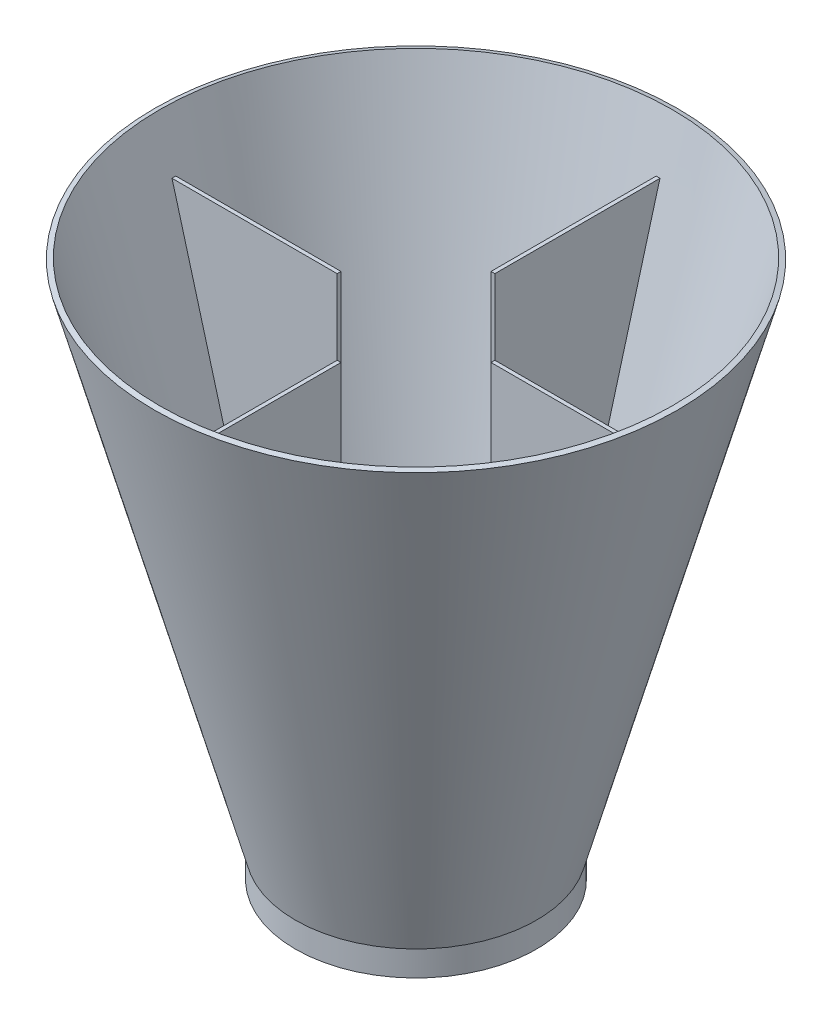
ISO-10303-21;
HEADER;
FILE_DESCRIPTION(('STEP AP214'),'2;1');
FILE_NAME('part.step','',(''),(''),'','','');
FILE_SCHEMA(('AUTOMOTIVE_DESIGN { 1 0 10303 214 1 1 1 1 }'));
ENDSEC;
DATA;
#1=APPLICATION_CONTEXT('core data for automotive mechanical design processes');
#2=APPLICATION_PROTOCOL_DEFINITION('international standard','automotive_design',2000,#1);
#3=PRODUCT_CONTEXT('',#1,'mechanical');
#4=PRODUCT('Part','Part','',(#3));
#5=PRODUCT_RELATED_PRODUCT_CATEGORY('part','',(#4));
#6=PRODUCT_DEFINITION_FORMATION('','',#4);
#7=PRODUCT_DEFINITION_CONTEXT('part definition',#1,'design');
#8=PRODUCT_DEFINITION('design','',#6,#7);
#9=PRODUCT_DEFINITION_SHAPE('','',#8);
#10=(LENGTH_UNIT() NAMED_UNIT(*) SI_UNIT(.MILLI.,.METRE.));
#11=(NAMED_UNIT(*) PLANE_ANGLE_UNIT() SI_UNIT($,.RADIAN.));
#12=(NAMED_UNIT(*) SI_UNIT($,.STERADIAN.) SOLID_ANGLE_UNIT());
#13=UNCERTAINTY_MEASURE_WITH_UNIT(LENGTH_MEASURE(1.E-05),#10,'distance_accuracy_value','');
#14=(GEOMETRIC_REPRESENTATION_CONTEXT(3) GLOBAL_UNCERTAINTY_ASSIGNED_CONTEXT((#13)) GLOBAL_UNIT_ASSIGNED_CONTEXT((#10,
#11,#12)) REPRESENTATION_CONTEXT('',''));
#15=CARTESIAN_POINT('',(0.,0.,0.));
#16=DIRECTION('',(0.,0.,1.));
#17=DIRECTION('',(1.,0.,0.));
#18=AXIS2_PLACEMENT_3D('',#15,#16,#17);
#19=CARTESIAN_POINT('',(-30.,30.,0.749999999999686));
#20=DIRECTION('',(0.,-1.,0.));
#21=DIRECTION('',(-1.,0.,0.));
#22=AXIS2_PLACEMENT_3D('',#19,#20,#21);
#23=PLANE('',#22);
#24=DIRECTION('',(0.,0.,-1.));
#25=VECTOR('',#24,1.);
#26=CARTESIAN_POINT('',(-53.25,30.,0.749999999999442));
#27=LINE('',#26,#25);
#28=CARTESIAN_POINT('',(-53.25,30.,0.749999999999442));
#29=VERTEX_POINT('',#28);
#30=CARTESIAN_POINT('',(-53.25,30.,-0.750000000000558));
#31=VERTEX_POINT('',#30);
#32=EDGE_CURVE('E58',#29,#31,#27,.T.);
#33=ORIENTED_EDGE('',*,*,#32,.T.);
#34=DIRECTION('',(-1.,0.,0.));
#35=VECTOR('',#34,1.);
#36=CARTESIAN_POINT('',(-30.,30.,-0.750000000000314));
#37=LINE('',#36,#35);
#38=CARTESIAN_POINT('',(-30.,30.,-0.750000000000314));
#39=VERTEX_POINT('',#38);
#40=EDGE_CURVE('E100',#39,#31,#37,.T.);
#41=ORIENTED_EDGE('',*,*,#40,.F.);
#42=DIRECTION('',(0.,0.,-1.));
#43=VECTOR('',#42,1.);
#44=CARTESIAN_POINT('',(-30.,30.,0.749999999999686));
#45=LINE('',#44,#43);
#46=CARTESIAN_POINT('',(-30.,30.,0.749999999999686));
#47=VERTEX_POINT('',#46);
#48=EDGE_CURVE('E12',#47,#39,#45,.T.);
#49=ORIENTED_EDGE('',*,*,#48,.F.);
#50=DIRECTION('',(-1.,0.,0.));
#51=VECTOR('',#50,1.);
#52=CARTESIAN_POINT('',(-30.,30.,0.749999999999686));
#53=LINE('',#52,#51);
#54=EDGE_CURVE('E98',#47,#29,#53,.T.);
#55=ORIENTED_EDGE('',*,*,#54,.T.);
#56=EDGE_LOOP('',(#33,#41,#49,#55));
#57=FACE_BOUND('',#56,.T.);
#58=ADVANCED_FACE('F60',(#57),#23,.T.);
#59=CARTESIAN_POINT('',(-30.,180.,0.749999999999686));
#60=DIRECTION('',(1.,0.,0.));
#61=DIRECTION('',(0.,-1.,0.));
#62=AXIS2_PLACEMENT_3D('',#59,#60,#61);
#63=PLANE('',#62);
#64=ORIENTED_EDGE('',*,*,#48,.T.);
#65=DIRECTION('',(0.,-1.,0.));
#66=VECTOR('',#65,1.);
#67=CARTESIAN_POINT('',(-30.,180.,-0.750000000000314));
#68=LINE('',#67,#66);
#69=CARTESIAN_POINT('',(-30.,180.,-0.750000000000314));
#70=VERTEX_POINT('',#69);
#71=EDGE_CURVE('E111',#70,#39,#68,.T.);
#72=ORIENTED_EDGE('',*,*,#71,.F.);
#73=DIRECTION('',(0.,0.,-1.));
#74=VECTOR('',#73,1.);
#75=CARTESIAN_POINT('',(-30.,180.,0.749999999999686));
#76=LINE('',#75,#74);
#77=CARTESIAN_POINT('',(-30.,180.,0.749999999999686));
#78=VERTEX_POINT('',#77);
#79=EDGE_CURVE('E62',#78,#70,#76,.T.);
#80=ORIENTED_EDGE('',*,*,#79,.F.);
#81=DIRECTION('',(0.,-1.,0.));
#82=VECTOR('',#81,1.);
#83=CARTESIAN_POINT('',(-30.,180.,0.749999999999686));
#84=LINE('',#83,#82);
#85=EDGE_CURVE('E103',#78,#47,#84,.T.);
#86=ORIENTED_EDGE('',*,*,#85,.T.);
#87=EDGE_LOOP('',(#64,#72,#80,#86));
#88=FACE_BOUND('',#87,.T.);
#89=ADVANCED_FACE('F129',(#88),#63,.T.);
#90=CARTESIAN_POINT('',(-30.,180.,0.749999999999686));
#91=DIRECTION('',(0.,1.,0.));
#92=DIRECTION('',(1.,0.,0.));
#93=AXIS2_PLACEMENT_3D('',#90,#91,#92);
#94=PLANE('',#93);
#95=ORIENTED_EDGE('',*,*,#79,.T.);
#96=DIRECTION('',(1.,0.,0.));
#97=VECTOR('',#96,1.);
#98=CARTESIAN_POINT('',(-30.,180.,-0.750000000000314));
#99=LINE('',#98,#97);
#100=CARTESIAN_POINT('',(-94.5,180.,-0.75000000000099));
#101=VERTEX_POINT('',#100);
#102=EDGE_CURVE('E109',#101,#70,#99,.T.);
#103=ORIENTED_EDGE('',*,*,#102,.F.);
#104=DIRECTION('',(0.,0.,-1.));
#105=VECTOR('',#104,1.);
#106=CARTESIAN_POINT('',(-94.5,180.,0.74999999999901));
#107=LINE('',#106,#105);
#108=CARTESIAN_POINT('',(-94.5,180.,0.74999999999901));
#109=VERTEX_POINT('',#108);
#110=EDGE_CURVE('E105',#109,#101,#107,.T.);
#111=ORIENTED_EDGE('',*,*,#110,.F.);
#112=DIRECTION('',(1.,0.,0.));
#113=VECTOR('',#112,1.);
#114=CARTESIAN_POINT('',(-30.,180.,0.749999999999686));
#115=LINE('',#114,#113);
#116=EDGE_CURVE('E124',#109,#78,#115,.T.);
#117=ORIENTED_EDGE('',*,*,#116,.T.);
#118=EDGE_LOOP('',(#95,#103,#111,#117));
#119=FACE_BOUND('',#118,.T.);
#120=ADVANCED_FACE('F127',(#119),#94,.T.);
#121=CARTESIAN_POINT('',(-94.5,180.,0.74999999999901));
#122=DIRECTION('',(-0.96420539280379,-0.265156483021042,0.));
#123=DIRECTION('',(-0.265156483021042,0.96420539280379,0.));
#124=AXIS2_PLACEMENT_3D('',#121,#122,#123);
#125=PLANE('',#124);
#126=ORIENTED_EDGE('',*,*,#110,.T.);
#127=DIRECTION('',(-0.265156483021042,0.96420539280379,0.));
#128=VECTOR('',#127,1.);
#129=CARTESIAN_POINT('',(-94.5,180.,-0.75000000000099));
#130=LINE('',#129,#128);
#131=EDGE_CURVE('E104',#31,#101,#130,.T.);
#132=ORIENTED_EDGE('',*,*,#131,.F.);
#133=ORIENTED_EDGE('',*,*,#32,.F.);
#134=DIRECTION('',(-0.265156483021042,0.96420539280379,0.));
#135=VECTOR('',#134,1.);
#136=CARTESIAN_POINT('',(-94.5,180.,0.74999999999901));
#137=LINE('',#136,#135);
#138=EDGE_CURVE('E117',#29,#109,#137,.T.);
#139=ORIENTED_EDGE('',*,*,#138,.T.);
#140=EDGE_LOOP('',(#126,#132,#133,#139));
#141=FACE_BOUND('',#140,.T.);
#142=ADVANCED_FACE('F106',(#141),#125,.T.);
#143=CARTESIAN_POINT('',(0.,0.,0.75));
#144=DIRECTION('',(0.,0.,1.));
#145=DIRECTION('',(1.,0.,0.));
#146=AXIS2_PLACEMENT_3D('',#143,#144,#145);
#147=PLANE('',#146);
#148=ORIENTED_EDGE('',*,*,#54,.F.);
#149=ORIENTED_EDGE('',*,*,#85,.F.);
#150=ORIENTED_EDGE('',*,*,#116,.F.);
#151=ORIENTED_EDGE('',*,*,#138,.F.);
#152=EDGE_LOOP('',(#148,#149,#150,#151));
#153=FACE_BOUND('',#152,.T.);
#154=ADVANCED_FACE('F134',(#153),#147,.T.);
#155=CARTESIAN_POINT('',(0.,0.,-0.75));
#156=DIRECTION('',(0.,0.,1.));
#157=DIRECTION('',(1.,0.,0.));
#158=AXIS2_PLACEMENT_3D('',#155,#156,#157);
#159=PLANE('',#158);
#160=ORIENTED_EDGE('',*,*,#40,.T.);
#161=ORIENTED_EDGE('',*,*,#131,.T.);
#162=ORIENTED_EDGE('',*,*,#102,.T.);
#163=ORIENTED_EDGE('',*,*,#71,.T.);
#164=EDGE_LOOP('',(#160,#161,#162,#163));
#165=FACE_BOUND('',#164,.T.);
#166=ADVANCED_FACE('F114',(#165),#159,.F.);
#167=CLOSED_SHELL('',(#58,#89,#120,#142,#154,#166));
#168=MANIFOLD_SOLID_BREP('B2',#167);
#169=CARTESIAN_POINT('',(0.75,30.,30.));
#170=DIRECTION('',(0.,-1.,0.));
#171=DIRECTION('',(0.,0.,1.));
#172=AXIS2_PLACEMENT_3D('',#169,#170,#171);
#173=PLANE('',#172);
#174=DIRECTION('',(-1.,0.,0.));
#175=VECTOR('',#174,1.);
#176=CARTESIAN_POINT('',(0.75,30.,53.25));
#177=LINE('',#176,#175);
#178=CARTESIAN_POINT('',(0.75,30.,53.25));
#179=VERTEX_POINT('',#178);
#180=CARTESIAN_POINT('',(-0.75,30.,53.25));
#181=VERTEX_POINT('',#180);
#182=EDGE_CURVE('E192',#179,#181,#177,.T.);
#183=ORIENTED_EDGE('',*,*,#182,.T.);
#184=DIRECTION('',(0.,0.,1.));
#185=VECTOR('',#184,1.);
#186=CARTESIAN_POINT('',(-0.75,30.,30.));
#187=LINE('',#186,#185);
#188=CARTESIAN_POINT('',(-0.75,30.,30.));
#189=VERTEX_POINT('',#188);
#190=EDGE_CURVE('E227',#189,#181,#187,.T.);
#191=ORIENTED_EDGE('',*,*,#190,.F.);
#192=DIRECTION('',(-1.,0.,0.));
#193=VECTOR('',#192,1.);
#194=CARTESIAN_POINT('',(0.75,30.,30.));
#195=LINE('',#194,#193);
#196=CARTESIAN_POINT('',(0.75,30.,30.));
#197=VERTEX_POINT('',#196);
#198=EDGE_CURVE('E54',#197,#189,#195,.T.);
#199=ORIENTED_EDGE('',*,*,#198,.F.);
#200=DIRECTION('',(0.,0.,1.));
#201=VECTOR('',#200,1.);
#202=CARTESIAN_POINT('',(0.75,30.,30.));
#203=LINE('',#202,#201);
#204=EDGE_CURVE('E233',#197,#179,#203,.T.);
#205=ORIENTED_EDGE('',*,*,#204,.T.);
#206=EDGE_LOOP('',(#183,#191,#199,#205));
#207=FACE_BOUND('',#206,.T.);
#208=ADVANCED_FACE('F187',(#207),#173,.T.);
#209=CARTESIAN_POINT('',(0.75,180.,30.));
#210=DIRECTION('',(0.,0.,-1.));
#211=DIRECTION('',(0.,-1.,0.));
#212=AXIS2_PLACEMENT_3D('',#209,#210,#211);
#213=PLANE('',#212);
#214=ORIENTED_EDGE('',*,*,#198,.T.);
#215=DIRECTION('',(0.,-1.,0.));
#216=VECTOR('',#215,1.);
#217=CARTESIAN_POINT('',(-0.75,180.,30.));
#218=LINE('',#217,#216);
#219=CARTESIAN_POINT('',(-0.75,180.,30.));
#220=VERTEX_POINT('',#219);
#221=EDGE_CURVE('E249',#220,#189,#218,.T.);
#222=ORIENTED_EDGE('',*,*,#221,.F.);
#223=DIRECTION('',(-1.,0.,0.));
#224=VECTOR('',#223,1.);
#225=CARTESIAN_POINT('',(0.75,180.,30.));
#226=LINE('',#225,#224);
#227=CARTESIAN_POINT('',(0.75,180.,30.));
#228=VERTEX_POINT('',#227);
#229=EDGE_CURVE('E196',#228,#220,#226,.T.);
#230=ORIENTED_EDGE('',*,*,#229,.F.);
#231=DIRECTION('',(0.,-1.,0.));
#232=VECTOR('',#231,1.);
#233=CARTESIAN_POINT('',(0.75,180.,30.));
#234=LINE('',#233,#232);
#235=EDGE_CURVE('E237',#228,#197,#234,.T.);
#236=ORIENTED_EDGE('',*,*,#235,.T.);
#237=EDGE_LOOP('',(#214,#222,#230,#236));
#238=FACE_BOUND('',#237,.T.);
#239=ADVANCED_FACE('F265',(#238),#213,.T.);
#240=CARTESIAN_POINT('',(0.75,180.,30.));
#241=DIRECTION('',(0.,1.,0.));
#242=DIRECTION('',(0.,0.,-1.));
#243=AXIS2_PLACEMENT_3D('',#240,#241,#242);
#244=PLANE('',#243);
#245=ORIENTED_EDGE('',*,*,#229,.T.);
#246=DIRECTION('',(0.,0.,-1.));
#247=VECTOR('',#246,1.);
#248=CARTESIAN_POINT('',(-0.75,180.,30.));
#249=LINE('',#248,#247);
#250=CARTESIAN_POINT('',(-0.75,180.,94.5));
#251=VERTEX_POINT('',#250);
#252=EDGE_CURVE('E245',#251,#220,#249,.T.);
#253=ORIENTED_EDGE('',*,*,#252,.F.);
#254=DIRECTION('',(-1.,0.,0.));
#255=VECTOR('',#254,1.);
#256=CARTESIAN_POINT('',(0.75,180.,94.5));
#257=LINE('',#256,#255);
#258=CARTESIAN_POINT('',(0.75,180.,94.5));
#259=VERTEX_POINT('',#258);
#260=EDGE_CURVE('E231',#259,#251,#257,.T.);
#261=ORIENTED_EDGE('',*,*,#260,.F.);
#262=DIRECTION('',(0.,0.,-1.));
#263=VECTOR('',#262,1.);
#264=CARTESIAN_POINT('',(0.75,180.,30.));
#265=LINE('',#264,#263);
#266=EDGE_CURVE('E254',#259,#228,#265,.T.);
#267=ORIENTED_EDGE('',*,*,#266,.T.);
#268=EDGE_LOOP('',(#245,#253,#261,#267));
#269=FACE_BOUND('',#268,.T.);
#270=ADVANCED_FACE('F259',(#269),#244,.T.);
#271=CARTESIAN_POINT('',(0.75,180.,94.5));
#272=DIRECTION('',(0.,-0.265156483021042,0.96420539280379));
#273=DIRECTION('',(0.,0.96420539280379,0.265156483021042));
#274=AXIS2_PLACEMENT_3D('',#271,#272,#273);
#275=PLANE('',#274);
#276=ORIENTED_EDGE('',*,*,#260,.T.);
#277=DIRECTION('',(0.,0.96420539280379,0.265156483021042));
#278=VECTOR('',#277,1.);
#279=CARTESIAN_POINT('',(-0.75,180.,94.5));
#280=LINE('',#279,#278);
#281=EDGE_CURVE('E236',#181,#251,#280,.T.);
#282=ORIENTED_EDGE('',*,*,#281,.F.);
#283=ORIENTED_EDGE('',*,*,#182,.F.);
#284=DIRECTION('',(0.,0.96420539280379,0.265156483021042));
#285=VECTOR('',#284,1.);
#286=CARTESIAN_POINT('',(0.75,180.,94.5));
#287=LINE('',#286,#285);
#288=EDGE_CURVE('E251',#179,#259,#287,.T.);
#289=ORIENTED_EDGE('',*,*,#288,.T.);
#290=EDGE_LOOP('',(#276,#282,#283,#289));
#291=FACE_BOUND('',#290,.T.);
#292=ADVANCED_FACE('F239',(#291),#275,.T.);
#293=CARTESIAN_POINT('',(0.75,0.,0.));
#294=DIRECTION('',(1.,0.,0.));
#295=DIRECTION('',(0.,0.,-1.));
#296=AXIS2_PLACEMENT_3D('',#293,#294,#295);
#297=PLANE('',#296);
#298=ORIENTED_EDGE('',*,*,#204,.F.);
#299=ORIENTED_EDGE('',*,*,#235,.F.);
#300=ORIENTED_EDGE('',*,*,#266,.F.);
#301=ORIENTED_EDGE('',*,*,#288,.F.);
#302=EDGE_LOOP('',(#298,#299,#300,#301));
#303=FACE_BOUND('',#302,.T.);
#304=ADVANCED_FACE('F262',(#303),#297,.T.);
#305=CARTESIAN_POINT('',(-0.75,0.,0.));
#306=DIRECTION('',(1.,0.,0.));
#307=DIRECTION('',(0.,0.,-1.));
#308=AXIS2_PLACEMENT_3D('',#305,#306,#307);
#309=PLANE('',#308);
#310=ORIENTED_EDGE('',*,*,#190,.T.);
#311=ORIENTED_EDGE('',*,*,#281,.T.);
#312=ORIENTED_EDGE('',*,*,#252,.T.);
#313=ORIENTED_EDGE('',*,*,#221,.T.);
#314=EDGE_LOOP('',(#310,#311,#312,#313));
#315=FACE_BOUND('',#314,.T.);
#316=ADVANCED_FACE('F248',(#315),#309,.F.);
#317=CLOSED_SHELL('',(#208,#239,#270,#292,#304,#316));
#318=MANIFOLD_SOLID_BREP('B6',#317);
#319=CARTESIAN_POINT('',(30.,30.,-0.749999999999895));
#320=DIRECTION('',(0.,-1.,0.));
#321=DIRECTION('',(1.,0.,0.));
#322=AXIS2_PLACEMENT_3D('',#319,#320,#321);
#323=PLANE('',#322);
#324=DIRECTION('',(0.,0.,1.));
#325=VECTOR('',#324,1.);
#326=CARTESIAN_POINT('',(53.25,30.,-0.749999999999814));
#327=LINE('',#326,#325);
#328=CARTESIAN_POINT('',(53.25,30.,-0.749999999999814));
#329=VERTEX_POINT('',#328);
#330=CARTESIAN_POINT('',(53.25,30.,0.750000000000186));
#331=VERTEX_POINT('',#330);
#332=EDGE_CURVE('E326',#329,#331,#327,.T.);
#333=ORIENTED_EDGE('',*,*,#332,.T.);
#334=DIRECTION('',(1.,0.,0.));
#335=VECTOR('',#334,1.);
#336=CARTESIAN_POINT('',(30.,30.,0.750000000000105));
#337=LINE('',#336,#335);
#338=CARTESIAN_POINT('',(30.,30.,0.750000000000105));
#339=VERTEX_POINT('',#338);
#340=EDGE_CURVE('E361',#339,#331,#337,.T.);
#341=ORIENTED_EDGE('',*,*,#340,.F.);
#342=DIRECTION('',(0.,0.,1.));
#343=VECTOR('',#342,1.);
#344=CARTESIAN_POINT('',(30.,30.,-0.749999999999895));
#345=LINE('',#344,#343);
#346=CARTESIAN_POINT('',(30.,30.,-0.749999999999895));
#347=VERTEX_POINT('',#346);
#348=EDGE_CURVE('E190',#347,#339,#345,.T.);
#349=ORIENTED_EDGE('',*,*,#348,.F.);
#350=DIRECTION('',(1.,0.,0.));
#351=VECTOR('',#350,1.);
#352=CARTESIAN_POINT('',(30.,30.,-0.749999999999895));
#353=LINE('',#352,#351);
#354=EDGE_CURVE('E365',#347,#329,#353,.T.);
#355=ORIENTED_EDGE('',*,*,#354,.T.);
#356=EDGE_LOOP('',(#333,#341,#349,#355));
#357=FACE_BOUND('',#356,.T.);
#358=ADVANCED_FACE('F323',(#357),#323,.T.);
#359=CARTESIAN_POINT('',(30.,180.,-0.749999999999895));
#360=DIRECTION('',(-1.,0.,0.));
#361=DIRECTION('',(0.,-1.,0.));
#362=AXIS2_PLACEMENT_3D('',#359,#360,#361);
#363=PLANE('',#362);
#364=ORIENTED_EDGE('',*,*,#348,.T.);
#365=DIRECTION('',(0.,-1.,0.));
#366=VECTOR('',#365,1.);
#367=CARTESIAN_POINT('',(30.,180.,0.750000000000105));
#368=LINE('',#367,#366);
#369=CARTESIAN_POINT('',(30.,180.,0.750000000000105));
#370=VERTEX_POINT('',#369);
#371=EDGE_CURVE('E379',#370,#339,#368,.T.);
#372=ORIENTED_EDGE('',*,*,#371,.F.);
#373=DIRECTION('',(0.,0.,1.));
#374=VECTOR('',#373,1.);
#375=CARTESIAN_POINT('',(30.,180.,-0.749999999999895));
#376=LINE('',#375,#374);
#377=CARTESIAN_POINT('',(30.,180.,-0.749999999999895));
#378=VERTEX_POINT('',#377);
#379=EDGE_CURVE('E332',#378,#370,#376,.T.);
#380=ORIENTED_EDGE('',*,*,#379,.F.);
#381=DIRECTION('',(0.,-1.,0.));
#382=VECTOR('',#381,1.);
#383=CARTESIAN_POINT('',(30.,180.,-0.749999999999895));
#384=LINE('',#383,#382);
#385=EDGE_CURVE('E369',#378,#347,#384,.T.);
#386=ORIENTED_EDGE('',*,*,#385,.T.);
#387=EDGE_LOOP('',(#364,#372,#380,#386));
#388=FACE_BOUND('',#387,.T.);
#389=ADVANCED_FACE('F392',(#388),#363,.T.);
#390=CARTESIAN_POINT('',(30.,180.,-0.749999999999895));
#391=DIRECTION('',(0.,1.,0.));
#392=DIRECTION('',(-1.,0.,0.));
#393=AXIS2_PLACEMENT_3D('',#390,#391,#392);
#394=PLANE('',#393);
#395=ORIENTED_EDGE('',*,*,#379,.T.);
#396=DIRECTION('',(-1.,0.,0.));
#397=VECTOR('',#396,1.);
#398=CARTESIAN_POINT('',(30.,180.,0.750000000000105));
#399=LINE('',#398,#397);
#400=CARTESIAN_POINT('',(94.5,180.,0.75000000000033));
#401=VERTEX_POINT('',#400);
#402=EDGE_CURVE('E376',#401,#370,#399,.T.);
#403=ORIENTED_EDGE('',*,*,#402,.F.);
#404=DIRECTION('',(0.,0.,1.));
#405=VECTOR('',#404,1.);
#406=CARTESIAN_POINT('',(94.5,180.,-0.74999999999967));
#407=LINE('',#406,#405);
#408=CARTESIAN_POINT('',(94.5,180.,-0.74999999999967));
#409=VERTEX_POINT('',#408);
#410=EDGE_CURVE('E366',#409,#401,#407,.T.);
#411=ORIENTED_EDGE('',*,*,#410,.F.);
#412=DIRECTION('',(-1.,0.,0.));
#413=VECTOR('',#412,1.);
#414=CARTESIAN_POINT('',(30.,180.,-0.749999999999895));
#415=LINE('',#414,#413);
#416=EDGE_CURVE('E389',#409,#378,#415,.T.);
#417=ORIENTED_EDGE('',*,*,#416,.T.);
#418=EDGE_LOOP('',(#395,#403,#411,#417));
#419=FACE_BOUND('',#418,.T.);
#420=ADVANCED_FACE('F391',(#419),#394,.T.);
#421=CARTESIAN_POINT('',(94.5,180.,-0.74999999999967));
#422=DIRECTION('',(0.96420539280379,-0.265156483021042,0.));
#423=DIRECTION('',(0.265156483021042,0.96420539280379,0.));
#424=AXIS2_PLACEMENT_3D('',#421,#422,#423);
#425=PLANE('',#424);
#426=ORIENTED_EDGE('',*,*,#410,.T.);
#427=DIRECTION('',(0.265156483021042,0.96420539280379,0.));
#428=VECTOR('',#427,1.);
#429=CARTESIAN_POINT('',(94.5,180.,0.75000000000033));
#430=LINE('',#429,#428);
#431=EDGE_CURVE('E371',#331,#401,#430,.T.);
#432=ORIENTED_EDGE('',*,*,#431,.F.);
#433=ORIENTED_EDGE('',*,*,#332,.F.);
#434=DIRECTION('',(0.265156483021042,0.96420539280379,0.));
#435=VECTOR('',#434,1.);
#436=CARTESIAN_POINT('',(94.5,180.,-0.74999999999967));
#437=LINE('',#436,#435);
#438=EDGE_CURVE('E387',#329,#409,#437,.T.);
#439=ORIENTED_EDGE('',*,*,#438,.T.);
#440=EDGE_LOOP('',(#426,#432,#433,#439));
#441=FACE_BOUND('',#440,.T.);
#442=ADVANCED_FACE('F375',(#441),#425,.T.);
#443=CARTESIAN_POINT('',(0.,0.,-0.75));
#444=DIRECTION('',(0.,0.,-1.));
#445=DIRECTION('',(-1.,0.,0.));
#446=AXIS2_PLACEMENT_3D('',#443,#444,#445);
#447=PLANE('',#446);
#448=ORIENTED_EDGE('',*,*,#354,.F.);
#449=ORIENTED_EDGE('',*,*,#385,.F.);
#450=ORIENTED_EDGE('',*,*,#416,.F.);
#451=ORIENTED_EDGE('',*,*,#438,.F.);
#452=EDGE_LOOP('',(#448,#449,#450,#451));
#453=FACE_BOUND('',#452,.T.);
#454=ADVANCED_FACE('F399',(#453),#447,.T.);
#455=CARTESIAN_POINT('',(0.,0.,0.75));
#456=DIRECTION('',(0.,0.,-1.));
#457=DIRECTION('',(-1.,0.,0.));
#458=AXIS2_PLACEMENT_3D('',#455,#456,#457);
#459=PLANE('',#458);
#460=ORIENTED_EDGE('',*,*,#340,.T.);
#461=ORIENTED_EDGE('',*,*,#431,.T.);
#462=ORIENTED_EDGE('',*,*,#402,.T.);
#463=ORIENTED_EDGE('',*,*,#371,.T.);
#464=EDGE_LOOP('',(#460,#461,#462,#463));
#465=FACE_BOUND('',#464,.T.);
#466=ADVANCED_FACE('F377',(#465),#459,.F.);
#467=CLOSED_SHELL('',(#358,#389,#420,#442,#454,#466));
#468=MANIFOLD_SOLID_BREP('B47',#467);
#469=CARTESIAN_POINT('',(-0.75,30.,-30.));
#470=DIRECTION('',(0.,-1.,0.));
#471=DIRECTION('',(0.,0.,-1.));
#472=AXIS2_PLACEMENT_3D('',#469,#470,#471);
#473=PLANE('',#472);
#474=DIRECTION('',(1.,0.,0.));
#475=VECTOR('',#474,1.);
#476=CARTESIAN_POINT('',(-0.75,30.,-53.25));
#477=LINE('',#476,#475);
#478=CARTESIAN_POINT('',(-0.75,30.,-53.25));
#479=VERTEX_POINT('',#478);
#480=CARTESIAN_POINT('',(0.75,30.,-53.25));
#481=VERTEX_POINT('',#480);
#482=EDGE_CURVE('E457',#479,#481,#477,.T.);
#483=ORIENTED_EDGE('',*,*,#482,.T.);
#484=DIRECTION('',(0.,0.,-1.));
#485=VECTOR('',#484,1.);
#486=CARTESIAN_POINT('',(0.75,30.,-30.));
#487=LINE('',#486,#485);
#488=CARTESIAN_POINT('',(0.75,30.,-30.));
#489=VERTEX_POINT('',#488);
#490=EDGE_CURVE('E492',#489,#481,#487,.T.);
#491=ORIENTED_EDGE('',*,*,#490,.F.);
#492=DIRECTION('',(1.,0.,0.));
#493=VECTOR('',#492,1.);
#494=CARTESIAN_POINT('',(-0.75,30.,-30.));
#495=LINE('',#494,#493);
#496=CARTESIAN_POINT('',(-0.75,30.,-30.));
#497=VERTEX_POINT('',#496);
#498=EDGE_CURVE('E321',#497,#489,#495,.T.);
#499=ORIENTED_EDGE('',*,*,#498,.F.);
#500=DIRECTION('',(0.,0.,-1.));
#501=VECTOR('',#500,1.);
#502=CARTESIAN_POINT('',(-0.75,30.,-30.));
#503=LINE('',#502,#501);
#504=EDGE_CURVE('E493',#497,#479,#503,.T.);
#505=ORIENTED_EDGE('',*,*,#504,.T.);
#506=EDGE_LOOP('',(#483,#491,#499,#505));
#507=FACE_BOUND('',#506,.T.);
#508=ADVANCED_FACE('F452',(#507),#473,.T.);
#509=CARTESIAN_POINT('',(-0.75,180.,-30.));
#510=DIRECTION('',(0.,0.,1.));
#511=DIRECTION('',(0.,-1.,0.));
#512=AXIS2_PLACEMENT_3D('',#509,#510,#511);
#513=PLANE('',#512);
#514=ORIENTED_EDGE('',*,*,#498,.T.);
#515=DIRECTION('',(0.,-1.,0.));
#516=VECTOR('',#515,1.);
#517=CARTESIAN_POINT('',(0.75,180.,-30.));
#518=LINE('',#517,#516);
#519=CARTESIAN_POINT('',(0.75,180.,-30.));
#520=VERTEX_POINT('',#519);
#521=EDGE_CURVE('E506',#520,#489,#518,.T.);
#522=ORIENTED_EDGE('',*,*,#521,.F.);
#523=DIRECTION('',(1.,0.,0.));
#524=VECTOR('',#523,1.);
#525=CARTESIAN_POINT('',(-0.75,180.,-30.));
#526=LINE('',#525,#524);
#527=CARTESIAN_POINT('',(-0.75,180.,-30.));
#528=VERTEX_POINT('',#527);
#529=EDGE_CURVE('E464',#528,#520,#526,.T.);
#530=ORIENTED_EDGE('',*,*,#529,.F.);
#531=DIRECTION('',(0.,-1.,0.));
#532=VECTOR('',#531,1.);
#533=CARTESIAN_POINT('',(-0.75,180.,-30.));
#534=LINE('',#533,#532);
#535=EDGE_CURVE('E496',#528,#497,#534,.T.);
#536=ORIENTED_EDGE('',*,*,#535,.T.);
#537=EDGE_LOOP('',(#514,#522,#530,#536));
#538=FACE_BOUND('',#537,.T.);
#539=ADVANCED_FACE('F521',(#538),#513,.T.);
#540=CARTESIAN_POINT('',(-0.75,180.,-30.));
#541=DIRECTION('',(0.,1.,0.));
#542=DIRECTION('',(0.,0.,1.));
#543=AXIS2_PLACEMENT_3D('',#540,#541,#542);
#544=PLANE('',#543);
#545=ORIENTED_EDGE('',*,*,#529,.T.);
#546=DIRECTION('',(0.,0.,1.));
#547=VECTOR('',#546,1.);
#548=CARTESIAN_POINT('',(0.75,180.,-30.));
#549=LINE('',#548,#547);
#550=CARTESIAN_POINT('',(0.75,180.,-94.5));
#551=VERTEX_POINT('',#550);
#552=EDGE_CURVE('E508',#551,#520,#549,.T.);
#553=ORIENTED_EDGE('',*,*,#552,.F.);
#554=DIRECTION('',(1.,0.,0.));
#555=VECTOR('',#554,1.);
#556=CARTESIAN_POINT('',(-0.75,180.,-94.5));
#557=LINE('',#556,#555);
#558=CARTESIAN_POINT('',(-0.75,180.,-94.5));
#559=VERTEX_POINT('',#558);
#560=EDGE_CURVE('E499',#559,#551,#557,.T.);
#561=ORIENTED_EDGE('',*,*,#560,.F.);
#562=DIRECTION('',(0.,0.,1.));
#563=VECTOR('',#562,1.);
#564=CARTESIAN_POINT('',(-0.75,180.,-30.));
#565=LINE('',#564,#563);
#566=EDGE_CURVE('E520',#559,#528,#565,.T.);
#567=ORIENTED_EDGE('',*,*,#566,.T.);
#568=EDGE_LOOP('',(#545,#553,#561,#567));
#569=FACE_BOUND('',#568,.T.);
#570=ADVANCED_FACE('F524',(#569),#544,.T.);
#571=CARTESIAN_POINT('',(-0.75,180.,-94.5));
#572=DIRECTION('',(0.,-0.265156483021042,-0.96420539280379));
#573=DIRECTION('',(0.,0.96420539280379,-0.265156483021042));
#574=AXIS2_PLACEMENT_3D('',#571,#572,#573);
#575=PLANE('',#574);
#576=ORIENTED_EDGE('',*,*,#560,.T.);
#577=DIRECTION('',(0.,0.96420539280379,-0.265156483021042));
#578=VECTOR('',#577,1.);
#579=CARTESIAN_POINT('',(0.75,180.,-94.5));
#580=LINE('',#579,#578);
#581=EDGE_CURVE('E504',#481,#551,#580,.T.);
#582=ORIENTED_EDGE('',*,*,#581,.F.);
#583=ORIENTED_EDGE('',*,*,#482,.F.);
#584=DIRECTION('',(0.,0.96420539280379,-0.265156483021042));
#585=VECTOR('',#584,1.);
#586=CARTESIAN_POINT('',(-0.75,180.,-94.5));
#587=LINE('',#586,#585);
#588=EDGE_CURVE('E519',#479,#559,#587,.T.);
#589=ORIENTED_EDGE('',*,*,#588,.T.);
#590=EDGE_LOOP('',(#576,#582,#583,#589));
#591=FACE_BOUND('',#590,.T.);
#592=ADVANCED_FACE('F501',(#591),#575,.T.);
#593=CARTESIAN_POINT('',(-0.75,0.,0.));
#594=DIRECTION('',(-1.,0.,0.));
#595=DIRECTION('',(0.,0.,1.));
#596=AXIS2_PLACEMENT_3D('',#593,#594,#595);
#597=PLANE('',#596);
#598=ORIENTED_EDGE('',*,*,#504,.F.);
#599=ORIENTED_EDGE('',*,*,#535,.F.);
#600=ORIENTED_EDGE('',*,*,#566,.F.);
#601=ORIENTED_EDGE('',*,*,#588,.F.);
#602=EDGE_LOOP('',(#598,#599,#600,#601));
#603=FACE_BOUND('',#602,.T.);
#604=ADVANCED_FACE('F527',(#603),#597,.T.);
#605=CARTESIAN_POINT('',(0.75,0.,0.));
#606=DIRECTION('',(-1.,0.,0.));
#607=DIRECTION('',(0.,0.,1.));
#608=AXIS2_PLACEMENT_3D('',#605,#606,#607);
#609=PLANE('',#608);
#610=ORIENTED_EDGE('',*,*,#490,.T.);
#611=ORIENTED_EDGE('',*,*,#581,.T.);
#612=ORIENTED_EDGE('',*,*,#552,.T.);
#613=ORIENTED_EDGE('',*,*,#521,.T.);
#614=EDGE_LOOP('',(#610,#611,#612,#613));
#615=FACE_BOUND('',#614,.T.);
#616=ADVANCED_FACE('F510',(#615),#609,.F.);
#617=CLOSED_SHELL('',(#508,#539,#570,#592,#604,#616));
#618=MANIFOLD_SOLID_BREP('B185',#617);
#619=CARTESIAN_POINT('',(0.,200.,0.));
#620=DIRECTION('',(0.,1.,0.));
#621=DIRECTION('',(0.,0.,1.));
#622=AXIS2_PLACEMENT_3D('',#619,#620,#621);
#623=CONICAL_SURFACE('',#622,100.,0.268366210905907);
#624=CARTESIAN_POINT('',(0.,0.,0.));
#625=DIRECTION('',(0.,1.,0.));
#626=DIRECTION('',(0.,0.,1.));
#627=AXIS2_PLACEMENT_3D('',#624,#625,#626);
#628=CIRCLE('',#627,45.);
#629=CARTESIAN_POINT('',(0.,0.,45.));
#630=VERTEX_POINT('',#629);
#631=EDGE_CURVE('E589',#630,#630,#628,.F.);
#632=ORIENTED_EDGE('',*,*,#631,.T.);
#633=EDGE_LOOP('',(#632));
#634=FACE_BOUND('',#633,.T.);
#635=CARTESIAN_POINT('',(0.,200.,0.));
#636=DIRECTION('',(0.,-1.,0.));
#637=DIRECTION('',(0.,0.,-1.));
#638=AXIS2_PLACEMENT_3D('',#635,#636,#637);
#639=CIRCLE('',#638,100.);
#640=CARTESIAN_POINT('',(0.,200.,-100.));
#641=VERTEX_POINT('',#640);
#642=EDGE_CURVE('E454',#641,#641,#639,.T.);
#643=ORIENTED_EDGE('',*,*,#642,.F.);
#644=EDGE_LOOP('',(#643));
#645=FACE_BOUND('',#644,.T.);
#646=ADVANCED_FACE('F578',(#634,#645),#623,.F.);
#647=CARTESIAN_POINT('',(0.,200.,0.));
#648=DIRECTION('',(0.,-1.,0.));
#649=DIRECTION('',(0.,0.,-1.));
#650=AXIS2_PLACEMENT_3D('',#647,#648,#649);
#651=CONICAL_SURFACE('',#650,100.,1.30243011588899);
#652=CARTESIAN_POINT('',(0.,199.469687033958,0.));
#653=DIRECTION('',(0.,-1.,0.));
#654=DIRECTION('',(0.,0.,-1.));
#655=AXIS2_PLACEMENT_3D('',#652,#653,#654);
#656=CIRCLE('',#655,101.928410785608);
#657=CARTESIAN_POINT('',(0.,199.469687033958,-101.928410785608));
#658=VERTEX_POINT('',#657);
#659=EDGE_CURVE('E581',#658,#658,#656,.T.);
#660=ORIENTED_EDGE('',*,*,#659,.F.);
#661=EDGE_LOOP('',(#660));
#662=FACE_BOUND('',#661,.T.);
#663=ORIENTED_EDGE('',*,*,#642,.T.);
#664=EDGE_LOOP('',(#663));
#665=FACE_BOUND('',#664,.T.);
#666=ADVANCED_FACE('F616',(#662,#665),#651,.T.);
#667=CARTESIAN_POINT('',(0.,199.469687033958,0.));
#668=DIRECTION('',(0.,1.,0.));
#669=DIRECTION('',(0.,0.,1.));
#670=AXIS2_PLACEMENT_3D('',#667,#668,#669);
#671=CONICAL_SURFACE('',#670,101.928410785608,0.268366210905907);
#672=CARTESIAN_POINT('',(0.,-0.206266023175722,0.));
#673=DIRECTION('',(0.,1.,0.));
#674=DIRECTION('',(0.,0.,1.));
#675=AXIS2_PLACEMENT_3D('',#672,#673,#674);
#676=CIRCLE('',#675,47.0175236948958);
#677=CARTESIAN_POINT('',(0.,-0.206266023175722,47.0175236948958));
#678=VERTEX_POINT('',#677);
#679=EDGE_CURVE('E580',#678,#678,#676,.T.);
#680=ORIENTED_EDGE('',*,*,#679,.T.);
#681=EDGE_LOOP('',(#680));
#682=FACE_BOUND('',#681,.T.);
#683=ORIENTED_EDGE('',*,*,#659,.T.);
#684=EDGE_LOOP('',(#683));
#685=FACE_BOUND('',#684,.T.);
#686=ADVANCED_FACE('F624',(#682,#685),#671,.T.);
#687=CARTESIAN_POINT('',(0.,-10.,0.));
#688=DIRECTION('',(0.,1.,0.));
#689=DIRECTION('',(0.,0.,1.));
#690=AXIS2_PLACEMENT_3D('',#687,#688,#689);
#691=CYLINDRICAL_SURFACE('',#690,47.0175236948958);
#692=CARTESIAN_POINT('',(0.,-10.,0.));
#693=DIRECTION('',(0.,1.,0.));
#694=DIRECTION('',(0.,0.,1.));
#695=AXIS2_PLACEMENT_3D('',#692,#693,#694);
#696=CIRCLE('',#695,47.0175236948958);
#697=CARTESIAN_POINT('',(0.,-10.,47.0175236948958));
#698=VERTEX_POINT('',#697);
#699=EDGE_CURVE('E595',#698,#698,#696,.T.);
#700=ORIENTED_EDGE('',*,*,#699,.T.);
#701=EDGE_LOOP('',(#700));
#702=FACE_BOUND('',#701,.T.);
#703=ORIENTED_EDGE('',*,*,#679,.F.);
#704=EDGE_LOOP('',(#703));
#705=FACE_BOUND('',#704,.T.);
#706=ADVANCED_FACE('F613',(#702,#705),#691,.T.);
#707=CARTESIAN_POINT('',(0.,0.,0.));
#708=DIRECTION('',(0.,1.,0.));
#709=DIRECTION('',(0.,0.,1.));
#710=AXIS2_PLACEMENT_3D('',#707,#708,#709);
#711=PLANE('',#710);
#712=CARTESIAN_POINT('',(0.,0.,0.));
#713=DIRECTION('',(0.,1.,0.));
#714=DIRECTION('',(0.,0.,1.));
#715=AXIS2_PLACEMENT_3D('',#712,#713,#714);
#716=CIRCLE('',#715,13.35);
#717=CARTESIAN_POINT('',(0.,0.,13.35));
#718=VERTEX_POINT('',#717);
#719=EDGE_CURVE('E596',#718,#718,#716,.T.);
#720=ORIENTED_EDGE('',*,*,#719,.F.);
#721=EDGE_LOOP('',(#720));
#722=FACE_BOUND('',#721,.T.);
#723=ORIENTED_EDGE('',*,*,#631,.F.);
#724=EDGE_LOOP('',(#723));
#725=FACE_BOUND('',#724,.T.);
#726=ADVANCED_FACE('F614',(#722,#725),#711,.T.);
#727=CARTESIAN_POINT('',(0.,-10.,0.));
#728=DIRECTION('',(0.,1.,0.));
#729=DIRECTION('',(0.,0.,1.));
#730=AXIS2_PLACEMENT_3D('',#727,#728,#729);
#731=PLANE('',#730);
#732=CARTESIAN_POINT('',(0.,-10.,0.));
#733=DIRECTION('',(0.,1.,0.));
#734=DIRECTION('',(0.,0.,1.));
#735=AXIS2_PLACEMENT_3D('',#732,#733,#734);
#736=CIRCLE('',#735,13.35);
#737=CARTESIAN_POINT('',(0.,-10.,13.35));
#738=VERTEX_POINT('',#737);
#739=EDGE_CURVE('E594',#738,#738,#736,.T.);
#740=ORIENTED_EDGE('',*,*,#739,.T.);
#741=EDGE_LOOP('',(#740));
#742=FACE_BOUND('',#741,.T.);
#743=ORIENTED_EDGE('',*,*,#699,.F.);
#744=EDGE_LOOP('',(#743));
#745=FACE_BOUND('',#744,.T.);
#746=ADVANCED_FACE('F605',(#742,#745),#731,.F.);
#747=CARTESIAN_POINT('',(0.,-10.,0.));
#748=DIRECTION('',(0.,1.,0.));
#749=DIRECTION('',(0.,0.,1.));
#750=AXIS2_PLACEMENT_3D('',#747,#748,#749);
#751=CYLINDRICAL_SURFACE('',#750,13.35);
#752=ORIENTED_EDGE('',*,*,#739,.F.);
#753=EDGE_LOOP('',(#752));
#754=FACE_BOUND('',#753,.T.);
#755=ORIENTED_EDGE('',*,*,#719,.T.);
#756=EDGE_LOOP('',(#755));
#757=FACE_BOUND('',#756,.T.);
#758=ADVANCED_FACE('F604',(#754,#757),#751,.F.);
#759=CLOSED_SHELL('',(#646,#666,#686,#706,#726,#746,#758));
#760=MANIFOLD_SOLID_BREP('B312',#759);
#761=ADVANCED_BREP_SHAPE_REPRESENTATION('',(#18,#168,#318,#468,#618,#760),#14);
#762=SHAPE_DEFINITION_REPRESENTATION(#9,#761);
ENDSEC;
END-ISO-10303-21;
